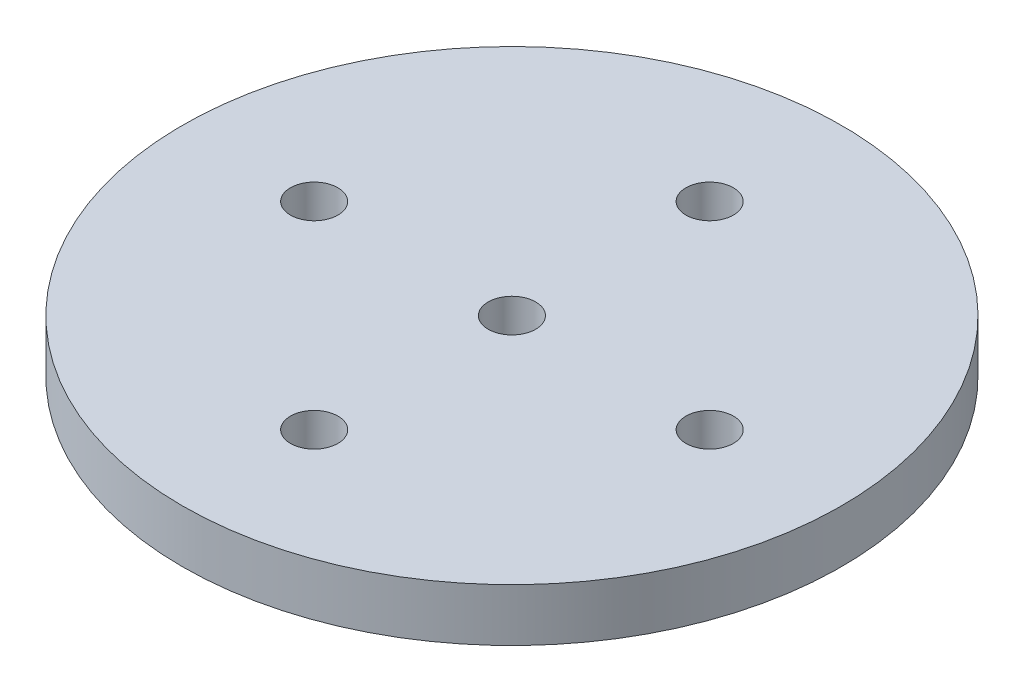
ISO-10303-21;
HEADER;
FILE_DESCRIPTION(('STEP AP214'),'2;1');
FILE_NAME('part.step','',(''),(''),'','','');
FILE_SCHEMA(('AUTOMOTIVE_DESIGN { 1 0 10303 214 1 1 1 1 }'));
ENDSEC;
DATA;
#1=APPLICATION_CONTEXT('core data for automotive mechanical design processes');
#2=APPLICATION_PROTOCOL_DEFINITION('international standard','automotive_design',2000,#1);
#3=PRODUCT_CONTEXT('',#1,'mechanical');
#4=PRODUCT('Part','Part','',(#3));
#5=PRODUCT_RELATED_PRODUCT_CATEGORY('part','',(#4));
#6=PRODUCT_DEFINITION_FORMATION('','',#4);
#7=PRODUCT_DEFINITION_CONTEXT('part definition',#1,'design');
#8=PRODUCT_DEFINITION('design','',#6,#7);
#9=PRODUCT_DEFINITION_SHAPE('','',#8);
#10=(LENGTH_UNIT() NAMED_UNIT(*) SI_UNIT(.MILLI.,.METRE.));
#11=(NAMED_UNIT(*) PLANE_ANGLE_UNIT() SI_UNIT($,.RADIAN.));
#12=(NAMED_UNIT(*) SI_UNIT($,.STERADIAN.) SOLID_ANGLE_UNIT());
#13=UNCERTAINTY_MEASURE_WITH_UNIT(LENGTH_MEASURE(1.E-05),#10,'distance_accuracy_value','');
#14=(GEOMETRIC_REPRESENTATION_CONTEXT(3) GLOBAL_UNCERTAINTY_ASSIGNED_CONTEXT((#13)) GLOBAL_UNIT_ASSIGNED_CONTEXT((#10,
#11,#12)) REPRESENTATION_CONTEXT('',''));
#15=CARTESIAN_POINT('',(0.,0.,0.));
#16=DIRECTION('',(0.,0.,1.));
#17=DIRECTION('',(1.,0.,0.));
#18=AXIS2_PLACEMENT_3D('',#15,#16,#17);
#19=CARTESIAN_POINT('',(0.,2.,0.));
#20=DIRECTION('',(0.,-1.,0.));
#21=DIRECTION('',(0.,0.,-1.));
#22=AXIS2_PLACEMENT_3D('',#19,#20,#21);
#23=CYLINDRICAL_SURFACE('',#22,12.5);
#24=CARTESIAN_POINT('',(0.,2.,0.));
#25=DIRECTION('',(0.,1.,0.));
#26=DIRECTION('',(0.,0.,1.));
#27=AXIS2_PLACEMENT_3D('',#24,#25,#26);
#28=CIRCLE('',#27,12.5);
#29=CARTESIAN_POINT('',(0.,2.,12.5));
#30=VERTEX_POINT('',#29);
#31=EDGE_CURVE('E52',#30,#30,#28,.T.);
#32=ORIENTED_EDGE('',*,*,#31,.F.);
#33=EDGE_LOOP('',(#32));
#34=FACE_BOUND('',#33,.T.);
#35=CARTESIAN_POINT('',(0.,0.,0.));
#36=DIRECTION('',(0.,1.,0.));
#37=DIRECTION('',(0.,0.,1.));
#38=AXIS2_PLACEMENT_3D('',#35,#36,#37);
#39=CIRCLE('',#38,12.5);
#40=CARTESIAN_POINT('',(0.,0.,12.5));
#41=VERTEX_POINT('',#40);
#42=EDGE_CURVE('E57',#41,#41,#39,.T.);
#43=ORIENTED_EDGE('',*,*,#42,.T.);
#44=EDGE_LOOP('',(#43));
#45=FACE_BOUND('',#44,.T.);
#46=ADVANCED_FACE('F45',(#34,#45),#23,.T.);
#47=CARTESIAN_POINT('',(0.,2.,0.));
#48=DIRECTION('',(0.,1.,0.));
#49=DIRECTION('',(0.,0.,1.));
#50=AXIS2_PLACEMENT_3D('',#47,#48,#49);
#51=PLANE('',#50);
#52=CARTESIAN_POINT('',(0.,2.,0.));
#53=DIRECTION('',(0.,1.,0.));
#54=DIRECTION('',(0.,0.,1.));
#55=AXIS2_PLACEMENT_3D('',#52,#53,#54);
#56=CIRCLE('',#55,0.899999999999999);
#57=CARTESIAN_POINT('',(0.,2.,0.899999999999999));
#58=VERTEX_POINT('',#57);
#59=EDGE_CURVE('E112',#58,#58,#56,.T.);
#60=ORIENTED_EDGE('',*,*,#59,.F.);
#61=EDGE_LOOP('',(#60));
#62=FACE_BOUND('',#61,.T.);
#63=CARTESIAN_POINT('',(0.,2.,-7.5));
#64=DIRECTION('',(0.,1.,0.));
#65=DIRECTION('',(0.,0.,1.));
#66=AXIS2_PLACEMENT_3D('',#63,#64,#65);
#67=CIRCLE('',#66,0.899999999999999);
#68=CARTESIAN_POINT('',(0.,2.,-6.6));
#69=VERTEX_POINT('',#68);
#70=EDGE_CURVE('E104',#69,#69,#67,.T.);
#71=ORIENTED_EDGE('',*,*,#70,.F.);
#72=EDGE_LOOP('',(#71));
#73=FACE_BOUND('',#72,.T.);
#74=CARTESIAN_POINT('',(7.5,2.,0.));
#75=DIRECTION('',(0.,1.,0.));
#76=DIRECTION('',(0.,0.,1.));
#77=AXIS2_PLACEMENT_3D('',#74,#75,#76);
#78=CIRCLE('',#77,0.9);
#79=CARTESIAN_POINT('',(7.5,2.,0.9));
#80=VERTEX_POINT('',#79);
#81=EDGE_CURVE('E96',#80,#80,#78,.T.);
#82=ORIENTED_EDGE('',*,*,#81,.F.);
#83=EDGE_LOOP('',(#82));
#84=FACE_BOUND('',#83,.T.);
#85=CARTESIAN_POINT('',(0.,2.,7.5));
#86=DIRECTION('',(0.,1.,0.));
#87=DIRECTION('',(0.,0.,1.));
#88=AXIS2_PLACEMENT_3D('',#85,#86,#87);
#89=CIRCLE('',#88,0.899999999999999);
#90=CARTESIAN_POINT('',(0.,2.,8.4));
#91=VERTEX_POINT('',#90);
#92=EDGE_CURVE('E88',#91,#91,#89,.T.);
#93=ORIENTED_EDGE('',*,*,#92,.F.);
#94=EDGE_LOOP('',(#93));
#95=FACE_BOUND('',#94,.T.);
#96=CARTESIAN_POINT('',(-7.5,2.,0.));
#97=DIRECTION('',(0.,1.,0.));
#98=DIRECTION('',(0.,0.,1.));
#99=AXIS2_PLACEMENT_3D('',#96,#97,#98);
#100=CIRCLE('',#99,0.9);
#101=CARTESIAN_POINT('',(-7.5,2.,0.899999999999947));
#102=VERTEX_POINT('',#101);
#103=EDGE_CURVE('E80',#102,#102,#100,.T.);
#104=ORIENTED_EDGE('',*,*,#103,.F.);
#105=EDGE_LOOP('',(#104));
#106=FACE_BOUND('',#105,.T.);
#107=ORIENTED_EDGE('',*,*,#31,.T.);
#108=EDGE_LOOP('',(#107));
#109=FACE_BOUND('',#108,.T.);
#110=ADVANCED_FACE('F119',(#62,#73,#84,#95,#106,#109),#51,.T.);
#111=CARTESIAN_POINT('',(0.,0.,0.));
#112=DIRECTION('',(0.,1.,0.));
#113=DIRECTION('',(0.,0.,1.));
#114=AXIS2_PLACEMENT_3D('',#111,#112,#113);
#115=PLANE('',#114);
#116=CARTESIAN_POINT('',(0.,0.,-7.5));
#117=DIRECTION('',(0.,1.,0.));
#118=DIRECTION('',(0.,0.,1.));
#119=AXIS2_PLACEMENT_3D('',#116,#117,#118);
#120=CIRCLE('',#119,0.899999999999999);
#121=CARTESIAN_POINT('',(0.,0.,-6.6));
#122=VERTEX_POINT('',#121);
#123=EDGE_CURVE('E100',#122,#122,#120,.T.);
#124=ORIENTED_EDGE('',*,*,#123,.T.);
#125=EDGE_LOOP('',(#124));
#126=FACE_BOUND('',#125,.T.);
#127=CARTESIAN_POINT('',(7.5,0.,0.));
#128=DIRECTION('',(0.,1.,0.));
#129=DIRECTION('',(0.,0.,1.));
#130=AXIS2_PLACEMENT_3D('',#127,#128,#129);
#131=CIRCLE('',#130,0.9);
#132=CARTESIAN_POINT('',(7.5,0.,0.9));
#133=VERTEX_POINT('',#132);
#134=EDGE_CURVE('E92',#133,#133,#131,.T.);
#135=ORIENTED_EDGE('',*,*,#134,.T.);
#136=EDGE_LOOP('',(#135));
#137=FACE_BOUND('',#136,.T.);
#138=CARTESIAN_POINT('',(0.,0.,7.5));
#139=DIRECTION('',(0.,1.,0.));
#140=DIRECTION('',(0.,0.,1.));
#141=AXIS2_PLACEMENT_3D('',#138,#139,#140);
#142=CIRCLE('',#141,0.899999999999999);
#143=CARTESIAN_POINT('',(0.,0.,8.4));
#144=VERTEX_POINT('',#143);
#145=EDGE_CURVE('E84',#144,#144,#142,.T.);
#146=ORIENTED_EDGE('',*,*,#145,.T.);
#147=EDGE_LOOP('',(#146));
#148=FACE_BOUND('',#147,.T.);
#149=CARTESIAN_POINT('',(-7.5,0.,0.));
#150=DIRECTION('',(0.,1.,0.));
#151=DIRECTION('',(0.,0.,1.));
#152=AXIS2_PLACEMENT_3D('',#149,#150,#151);
#153=CIRCLE('',#152,0.9);
#154=CARTESIAN_POINT('',(-7.5,0.,0.899999999999947));
#155=VERTEX_POINT('',#154);
#156=EDGE_CURVE('E76',#155,#155,#153,.T.);
#157=ORIENTED_EDGE('',*,*,#156,.T.);
#158=EDGE_LOOP('',(#157));
#159=FACE_BOUND('',#158,.T.);
#160=CARTESIAN_POINT('',(0.,0.,0.));
#161=DIRECTION('',(0.,1.,0.));
#162=DIRECTION('',(0.,0.,1.));
#163=AXIS2_PLACEMENT_3D('',#160,#161,#162);
#164=CIRCLE('',#163,4.5);
#165=CARTESIAN_POINT('',(0.,0.,4.5));
#166=VERTEX_POINT('',#165);
#167=EDGE_CURVE('E65',#166,#166,#164,.T.);
#168=ORIENTED_EDGE('',*,*,#167,.T.);
#169=EDGE_LOOP('',(#168));
#170=FACE_BOUND('',#169,.T.);
#171=ORIENTED_EDGE('',*,*,#42,.F.);
#172=EDGE_LOOP('',(#171));
#173=FACE_BOUND('',#172,.T.);
#174=ADVANCED_FACE('F122',(#126,#137,#148,#159,#170,#173),#115,.F.);
#175=CARTESIAN_POINT('',(0.,-4.,0.));
#176=DIRECTION('',(0.,1.,0.));
#177=DIRECTION('',(0.,0.,1.));
#178=AXIS2_PLACEMENT_3D('',#175,#176,#177);
#179=CYLINDRICAL_SURFACE('',#178,4.5);
#180=CARTESIAN_POINT('',(0.,-4.,0.));
#181=DIRECTION('',(0.,1.,0.));
#182=DIRECTION('',(0.,0.,1.));
#183=AXIS2_PLACEMENT_3D('',#180,#181,#182);
#184=CIRCLE('',#183,4.5);
#185=CARTESIAN_POINT('',(0.,-4.,4.5));
#186=VERTEX_POINT('',#185);
#187=EDGE_CURVE('E63',#186,#186,#184,.T.);
#188=ORIENTED_EDGE('',*,*,#187,.T.);
#189=EDGE_LOOP('',(#188));
#190=FACE_BOUND('',#189,.T.);
#191=ORIENTED_EDGE('',*,*,#167,.F.);
#192=EDGE_LOOP('',(#191));
#193=FACE_BOUND('',#192,.T.);
#194=ADVANCED_FACE('F157',(#190,#193),#179,.T.);
#195=CARTESIAN_POINT('',(0.,-4.,0.));
#196=DIRECTION('',(0.,1.,0.));
#197=DIRECTION('',(0.,0.,1.));
#198=AXIS2_PLACEMENT_3D('',#195,#196,#197);
#199=PLANE('',#198);
#200=CARTESIAN_POINT('',(0.,-4.,0.));
#201=DIRECTION('',(0.,1.,0.));
#202=DIRECTION('',(0.,0.,1.));
#203=AXIS2_PLACEMENT_3D('',#200,#201,#202);
#204=CIRCLE('',#203,2.9);
#205=CARTESIAN_POINT('',(0.,-4.,2.9));
#206=VERTEX_POINT('',#205);
#207=EDGE_CURVE('E69',#206,#206,#204,.T.);
#208=ORIENTED_EDGE('',*,*,#207,.T.);
#209=EDGE_LOOP('',(#208));
#210=FACE_BOUND('',#209,.T.);
#211=ORIENTED_EDGE('',*,*,#187,.F.);
#212=EDGE_LOOP('',(#211));
#213=FACE_BOUND('',#212,.T.);
#214=ADVANCED_FACE('F162',(#210,#213),#199,.F.);
#215=CARTESIAN_POINT('',(0.,-4.,0.));
#216=DIRECTION('',(0.,1.,0.));
#217=DIRECTION('',(0.,0.,1.));
#218=AXIS2_PLACEMENT_3D('',#215,#216,#217);
#219=CYLINDRICAL_SURFACE('',#218,2.9);
#220=ORIENTED_EDGE('',*,*,#207,.F.);
#221=EDGE_LOOP('',(#220));
#222=FACE_BOUND('',#221,.T.);
#223=CARTESIAN_POINT('',(0.,0.,0.));
#224=DIRECTION('',(0.,1.,0.));
#225=DIRECTION('',(0.,0.,1.));
#226=AXIS2_PLACEMENT_3D('',#223,#224,#225);
#227=CIRCLE('',#226,2.9);
#228=CARTESIAN_POINT('',(0.,0.,2.9));
#229=VERTEX_POINT('',#228);
#230=EDGE_CURVE('E11',#229,#229,#227,.T.);
#231=ORIENTED_EDGE('',*,*,#230,.T.);
#232=EDGE_LOOP('',(#231));
#233=FACE_BOUND('',#232,.T.);
#234=ADVANCED_FACE('F145',(#222,#233),#219,.F.);
#235=CARTESIAN_POINT('',(0.,0.,0.));
#236=DIRECTION('',(0.,1.,0.));
#237=DIRECTION('',(0.,0.,1.));
#238=AXIS2_PLACEMENT_3D('',#235,#236,#237);
#239=CIRCLE('',#238,0.899999999999999);
#240=CARTESIAN_POINT('',(0.,0.,0.899999999999999));
#241=VERTEX_POINT('',#240);
#242=EDGE_CURVE('E108',#241,#241,#239,.T.);
#243=ORIENTED_EDGE('',*,*,#242,.T.);
#244=EDGE_LOOP('',(#243));
#245=FACE_BOUND('',#244,.T.);
#246=ORIENTED_EDGE('',*,*,#230,.F.);
#247=EDGE_LOOP('',(#246));
#248=FACE_BOUND('',#247,.T.);
#249=ADVANCED_FACE('F135',(#245,#248),#115,.F.);
#250=CARTESIAN_POINT('',(-7.5,2.,0.));
#251=DIRECTION('',(0.,1.,0.));
#252=DIRECTION('',(0.,0.,1.));
#253=AXIS2_PLACEMENT_3D('',#250,#251,#252);
#254=CYLINDRICAL_SURFACE('',#253,0.9);
#255=ORIENTED_EDGE('',*,*,#156,.F.);
#256=EDGE_LOOP('',(#255));
#257=FACE_BOUND('',#256,.T.);
#258=ORIENTED_EDGE('',*,*,#103,.T.);
#259=EDGE_LOOP('',(#258));
#260=FACE_BOUND('',#259,.T.);
#261=ADVANCED_FACE('F132',(#257,#260),#254,.F.);
#262=CARTESIAN_POINT('',(0.,2.,7.5));
#263=DIRECTION('',(0.,1.,0.));
#264=DIRECTION('',(0.,0.,1.));
#265=AXIS2_PLACEMENT_3D('',#262,#263,#264);
#266=CYLINDRICAL_SURFACE('',#265,0.899999999999999);
#267=ORIENTED_EDGE('',*,*,#145,.F.);
#268=EDGE_LOOP('',(#267));
#269=FACE_BOUND('',#268,.T.);
#270=ORIENTED_EDGE('',*,*,#92,.T.);
#271=EDGE_LOOP('',(#270));
#272=FACE_BOUND('',#271,.T.);
#273=ADVANCED_FACE('F134',(#269,#272),#266,.F.);
#274=CARTESIAN_POINT('',(7.5,2.,0.));
#275=DIRECTION('',(0.,1.,0.));
#276=DIRECTION('',(0.,0.,1.));
#277=AXIS2_PLACEMENT_3D('',#274,#275,#276);
#278=CYLINDRICAL_SURFACE('',#277,0.9);
#279=ORIENTED_EDGE('',*,*,#134,.F.);
#280=EDGE_LOOP('',(#279));
#281=FACE_BOUND('',#280,.T.);
#282=ORIENTED_EDGE('',*,*,#81,.T.);
#283=EDGE_LOOP('',(#282));
#284=FACE_BOUND('',#283,.T.);
#285=ADVANCED_FACE('F142',(#281,#284),#278,.F.);
#286=CARTESIAN_POINT('',(0.,2.,-7.5));
#287=DIRECTION('',(0.,1.,0.));
#288=DIRECTION('',(0.,0.,1.));
#289=AXIS2_PLACEMENT_3D('',#286,#287,#288);
#290=CYLINDRICAL_SURFACE('',#289,0.899999999999999);
#291=ORIENTED_EDGE('',*,*,#123,.F.);
#292=EDGE_LOOP('',(#291));
#293=FACE_BOUND('',#292,.T.);
#294=ORIENTED_EDGE('',*,*,#70,.T.);
#295=EDGE_LOOP('',(#294));
#296=FACE_BOUND('',#295,.T.);
#297=ADVANCED_FACE('F208',(#293,#296),#290,.F.);
#298=CARTESIAN_POINT('',(0.,2.,0.));
#299=DIRECTION('',(0.,1.,0.));
#300=DIRECTION('',(0.,0.,1.));
#301=AXIS2_PLACEMENT_3D('',#298,#299,#300);
#302=CYLINDRICAL_SURFACE('',#301,0.899999999999999);
#303=ORIENTED_EDGE('',*,*,#242,.F.);
#304=EDGE_LOOP('',(#303));
#305=FACE_BOUND('',#304,.T.);
#306=ORIENTED_EDGE('',*,*,#59,.T.);
#307=EDGE_LOOP('',(#306));
#308=FACE_BOUND('',#307,.T.);
#309=ADVANCED_FACE('F117',(#305,#308),#302,.F.);
#310=CLOSED_SHELL('',(#46,#110,#174,#194,#214,#234,#249,#261,#273,#285,#297,#309));
#311=MANIFOLD_SOLID_BREP('B2',#310);
#312=ADVANCED_BREP_SHAPE_REPRESENTATION('',(#18,#311),#14);
#313=SHAPE_DEFINITION_REPRESENTATION(#9,#312);
ENDSEC;
END-ISO-10303-21;
